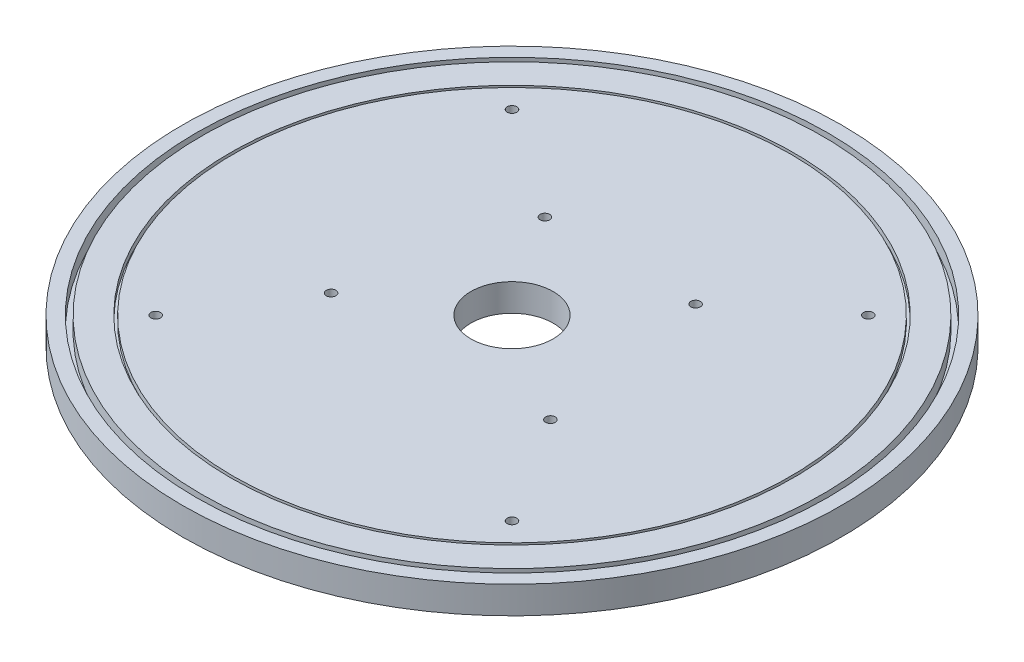
ISO-10303-21;
HEADER;
FILE_DESCRIPTION(('STEP AP214'),'2;1');
FILE_NAME('part.step','',(''),(''),'','','');
FILE_SCHEMA(('AUTOMOTIVE_DESIGN { 1 0 10303 214 1 1 1 1 }'));
ENDSEC;
DATA;
#1=APPLICATION_CONTEXT('core data for automotive mechanical design processes');
#2=APPLICATION_PROTOCOL_DEFINITION('international standard','automotive_design',2000,#1);
#3=PRODUCT_CONTEXT('',#1,'mechanical');
#4=PRODUCT('Part','Part','',(#3));
#5=PRODUCT_RELATED_PRODUCT_CATEGORY('part','',(#4));
#6=PRODUCT_DEFINITION_FORMATION('','',#4);
#7=PRODUCT_DEFINITION_CONTEXT('part definition',#1,'design');
#8=PRODUCT_DEFINITION('design','',#6,#7);
#9=PRODUCT_DEFINITION_SHAPE('','',#8);
#10=(LENGTH_UNIT() NAMED_UNIT(*) SI_UNIT(.MILLI.,.METRE.));
#11=(NAMED_UNIT(*) PLANE_ANGLE_UNIT() SI_UNIT($,.RADIAN.));
#12=(NAMED_UNIT(*) SI_UNIT($,.STERADIAN.) SOLID_ANGLE_UNIT());
#13=UNCERTAINTY_MEASURE_WITH_UNIT(LENGTH_MEASURE(1.E-05),#10,'distance_accuracy_value','');
#14=(GEOMETRIC_REPRESENTATION_CONTEXT(3) GLOBAL_UNCERTAINTY_ASSIGNED_CONTEXT((#13)) GLOBAL_UNIT_ASSIGNED_CONTEXT((#10,
#11,#12)) REPRESENTATION_CONTEXT('',''));
#15=CARTESIAN_POINT('',(0.,0.,0.));
#16=DIRECTION('',(0.,0.,1.));
#17=DIRECTION('',(1.,0.,0.));
#18=AXIS2_PLACEMENT_3D('',#15,#16,#17);
#19=CARTESIAN_POINT('',(0.,10.,-115.250303869911));
#20=DIRECTION('',(0.,-1.,0.));
#21=DIRECTION('',(0.,0.,-1.));
#22=AXIS2_PLACEMENT_3D('',#19,#20,#21);
#23=PLANE('',#22);
#24=CARTESIAN_POINT('',(0.,10.,-0.00437551765879174));
#25=DIRECTION('',(0.,1.,0.));
#26=DIRECTION('',(0.,0.,1.));
#27=AXIS2_PLACEMENT_3D('',#24,#25,#26);
#28=CIRCLE('',#27,115.245928352253);
#29=CARTESIAN_POINT('',(0.,10.,115.241552834594));
#30=VERTEX_POINT('',#29);
#31=EDGE_CURVE('E66',#30,#30,#28,.T.);
#32=ORIENTED_EDGE('',*,*,#31,.F.);
#33=EDGE_LOOP('',(#32));
#34=FACE_BOUND('',#33,.T.);
#35=CARTESIAN_POINT('',(0.,10.,-0.00437551765879174));
#36=DIRECTION('',(0.,1.,0.));
#37=DIRECTION('',(0.,0.,1.));
#38=AXIS2_PLACEMENT_3D('',#35,#36,#37);
#39=CIRCLE('',#38,120.249921644883);
#40=CARTESIAN_POINT('',(0.,10.,120.245546127224));
#41=VERTEX_POINT('',#40);
#42=EDGE_CURVE('E10',#41,#41,#39,.T.);
#43=ORIENTED_EDGE('',*,*,#42,.T.);
#44=EDGE_LOOP('',(#43));
#45=FACE_BOUND('',#44,.T.);
#46=ADVANCED_FACE('F32',(#34,#45),#23,.F.);
#47=CARTESIAN_POINT('',(0.,9.99999999999999,-0.00437551765879174));
#48=DIRECTION('',(0.,1.,0.));
#49=DIRECTION('',(0.,0.,1.));
#50=AXIS2_PLACEMENT_3D('',#47,#48,#49);
#51=CYLINDRICAL_SURFACE('',#50,120.249921644883);
#52=ORIENTED_EDGE('',*,*,#42,.F.);
#53=EDGE_LOOP('',(#52));
#54=FACE_BOUND('',#53,.T.);
#55=CARTESIAN_POINT('',(0.,0.,-0.00437551765879174));
#56=DIRECTION('',(0.,1.,0.));
#57=DIRECTION('',(0.,0.,1.));
#58=AXIS2_PLACEMENT_3D('',#55,#56,#57);
#59=CIRCLE('',#58,120.249921644883);
#60=CARTESIAN_POINT('',(0.,0.,120.245546127224));
#61=VERTEX_POINT('',#60);
#62=EDGE_CURVE('E38',#61,#61,#59,.T.);
#63=ORIENTED_EDGE('',*,*,#62,.T.);
#64=EDGE_LOOP('',(#63));
#65=FACE_BOUND('',#64,.T.);
#66=ADVANCED_FACE('F138',(#54,#65),#51,.T.);
#67=CARTESIAN_POINT('',(0.,0.,-120.254297162542));
#68=DIRECTION('',(0.,1.,0.));
#69=DIRECTION('',(0.,0.,1.));
#70=AXIS2_PLACEMENT_3D('',#67,#68,#69);
#71=PLANE('',#70);
#72=CARTESIAN_POINT('',(-65.,0.,-65.));
#73=DIRECTION('',(0.,-1.,0.));
#74=DIRECTION('',(0.,0.,-1.));
#75=AXIS2_PLACEMENT_3D('',#72,#73,#74);
#76=CIRCLE('',#75,1.75);
#77=CARTESIAN_POINT('',(-65.,0.,-66.75));
#78=VERTEX_POINT('',#77);
#79=EDGE_CURVE('E113',#78,#78,#76,.T.);
#80=ORIENTED_EDGE('',*,*,#79,.F.);
#81=EDGE_LOOP('',(#80));
#82=FACE_BOUND('',#81,.T.);
#83=CARTESIAN_POINT('',(65.,0.,65.));
#84=DIRECTION('',(0.,-1.,0.));
#85=DIRECTION('',(0.,0.,-1.));
#86=AXIS2_PLACEMENT_3D('',#83,#84,#85);
#87=CIRCLE('',#86,1.75);
#88=CARTESIAN_POINT('',(65.,0.,63.25));
#89=VERTEX_POINT('',#88);
#90=EDGE_CURVE('E106',#89,#89,#87,.T.);
#91=ORIENTED_EDGE('',*,*,#90,.F.);
#92=EDGE_LOOP('',(#91));
#93=FACE_BOUND('',#92,.T.);
#94=CARTESIAN_POINT('',(65.,0.,-65.));
#95=DIRECTION('',(0.,-1.,0.));
#96=DIRECTION('',(0.,0.,-1.));
#97=AXIS2_PLACEMENT_3D('',#94,#95,#96);
#98=CIRCLE('',#97,1.75);
#99=CARTESIAN_POINT('',(65.,0.,-66.75));
#100=VERTEX_POINT('',#99);
#101=EDGE_CURVE('E118',#100,#100,#98,.T.);
#102=ORIENTED_EDGE('',*,*,#101,.F.);
#103=EDGE_LOOP('',(#102));
#104=FACE_BOUND('',#103,.T.);
#105=CARTESIAN_POINT('',(-65.,0.,65.));
#106=DIRECTION('',(0.,-1.,0.));
#107=DIRECTION('',(0.,0.,-1.));
#108=AXIS2_PLACEMENT_3D('',#105,#106,#107);
#109=CIRCLE('',#108,1.75);
#110=CARTESIAN_POINT('',(-65.,0.,63.25));
#111=VERTEX_POINT('',#110);
#112=EDGE_CURVE('E100',#111,#111,#109,.T.);
#113=ORIENTED_EDGE('',*,*,#112,.F.);
#114=EDGE_LOOP('',(#113));
#115=FACE_BOUND('',#114,.T.);
#116=CARTESIAN_POINT('',(30.,0.,-37.));
#117=DIRECTION('',(0.,-1.,0.));
#118=DIRECTION('',(0.,0.,-1.));
#119=AXIS2_PLACEMENT_3D('',#116,#117,#118);
#120=CIRCLE('',#119,1.75);
#121=CARTESIAN_POINT('',(30.,0.,-38.75));
#122=VERTEX_POINT('',#121);
#123=EDGE_CURVE('E82',#122,#122,#120,.T.);
#124=ORIENTED_EDGE('',*,*,#123,.F.);
#125=EDGE_LOOP('',(#124));
#126=FACE_BOUND('',#125,.T.);
#127=CARTESIAN_POINT('',(40.,0.,26.));
#128=DIRECTION('',(0.,-1.,0.));
#129=DIRECTION('',(0.,0.,-1.));
#130=AXIS2_PLACEMENT_3D('',#127,#128,#129);
#131=CIRCLE('',#130,1.75);
#132=CARTESIAN_POINT('',(40.,0.,24.25));
#133=VERTEX_POINT('',#132);
#134=EDGE_CURVE('E89',#133,#133,#131,.T.);
#135=ORIENTED_EDGE('',*,*,#134,.F.);
#136=EDGE_LOOP('',(#135));
#137=FACE_BOUND('',#136,.T.);
#138=CARTESIAN_POINT('',(-40.,0.,26.));
#139=DIRECTION('',(0.,-1.,0.));
#140=DIRECTION('',(0.,0.,-1.));
#141=AXIS2_PLACEMENT_3D('',#138,#139,#140);
#142=CIRCLE('',#141,1.75);
#143=CARTESIAN_POINT('',(-40.,0.,24.25));
#144=VERTEX_POINT('',#143);
#145=EDGE_CURVE('E95',#144,#144,#142,.T.);
#146=ORIENTED_EDGE('',*,*,#145,.F.);
#147=EDGE_LOOP('',(#146));
#148=FACE_BOUND('',#147,.T.);
#149=CARTESIAN_POINT('',(-25.,0.,-37.));
#150=DIRECTION('',(0.,-1.,0.));
#151=DIRECTION('',(0.,0.,-1.));
#152=AXIS2_PLACEMENT_3D('',#149,#150,#151);
#153=CIRCLE('',#152,1.75);
#154=CARTESIAN_POINT('',(-25.,0.,-38.75));
#155=VERTEX_POINT('',#154);
#156=EDGE_CURVE('E76',#155,#155,#153,.T.);
#157=ORIENTED_EDGE('',*,*,#156,.F.);
#158=EDGE_LOOP('',(#157));
#159=FACE_BOUND('',#158,.T.);
#160=CARTESIAN_POINT('',(0.,0.,0.));
#161=DIRECTION('',(0.,1.,0.));
#162=DIRECTION('',(0.,0.,1.));
#163=AXIS2_PLACEMENT_3D('',#160,#161,#162);
#164=CIRCLE('',#163,15.);
#165=CARTESIAN_POINT('',(0.,0.,15.));
#166=VERTEX_POINT('',#165);
#167=EDGE_CURVE('E69',#166,#166,#164,.T.);
#168=ORIENTED_EDGE('',*,*,#167,.T.);
#169=EDGE_LOOP('',(#168));
#170=FACE_BOUND('',#169,.T.);
#171=ORIENTED_EDGE('',*,*,#62,.F.);
#172=EDGE_LOOP('',(#171));
#173=FACE_BOUND('',#172,.T.);
#174=ADVANCED_FACE('F135',(#82,#93,#104,#115,#126,#137,#148,#159,#170,#173),#71,.F.);
#175=CARTESIAN_POINT('',(0.,9.99999999999999,-101.754375517659));
#176=DIRECTION('',(0.,-1.,0.));
#177=DIRECTION('',(0.,0.,-1.));
#178=AXIS2_PLACEMENT_3D('',#175,#176,#177);
#179=PLANE('',#178);
#180=CARTESIAN_POINT('',(-65.,10.,-65.));
#181=DIRECTION('',(0.,-1.,0.));
#182=DIRECTION('',(0.,0.,-1.));
#183=AXIS2_PLACEMENT_3D('',#180,#181,#182);
#184=CIRCLE('',#183,1.75);
#185=CARTESIAN_POINT('',(-65.,10.,-66.75));
#186=VERTEX_POINT('',#185);
#187=EDGE_CURVE('E103',#186,#186,#184,.T.);
#188=ORIENTED_EDGE('',*,*,#187,.T.);
#189=EDGE_LOOP('',(#188));
#190=FACE_BOUND('',#189,.T.);
#191=CARTESIAN_POINT('',(65.,10.,65.));
#192=DIRECTION('',(0.,-1.,0.));
#193=DIRECTION('',(0.,0.,-1.));
#194=AXIS2_PLACEMENT_3D('',#191,#192,#193);
#195=CIRCLE('',#194,1.75);
#196=CARTESIAN_POINT('',(65.,10.,63.25));
#197=VERTEX_POINT('',#196);
#198=EDGE_CURVE('E109',#197,#197,#195,.T.);
#199=ORIENTED_EDGE('',*,*,#198,.T.);
#200=EDGE_LOOP('',(#199));
#201=FACE_BOUND('',#200,.T.);
#202=CARTESIAN_POINT('',(65.,10.,-65.));
#203=DIRECTION('',(0.,-1.,0.));
#204=DIRECTION('',(0.,0.,-1.));
#205=AXIS2_PLACEMENT_3D('',#202,#203,#204);
#206=CIRCLE('',#205,1.75);
#207=CARTESIAN_POINT('',(65.,10.,-66.75));
#208=VERTEX_POINT('',#207);
#209=EDGE_CURVE('E110',#208,#208,#206,.T.);
#210=ORIENTED_EDGE('',*,*,#209,.T.);
#211=EDGE_LOOP('',(#210));
#212=FACE_BOUND('',#211,.T.);
#213=CARTESIAN_POINT('',(-65.,10.,65.));
#214=DIRECTION('',(0.,-1.,0.));
#215=DIRECTION('',(0.,0.,-1.));
#216=AXIS2_PLACEMENT_3D('',#213,#214,#215);
#217=CIRCLE('',#216,1.75);
#218=CARTESIAN_POINT('',(-65.,10.,63.25));
#219=VERTEX_POINT('',#218);
#220=EDGE_CURVE('E86',#219,#219,#217,.T.);
#221=ORIENTED_EDGE('',*,*,#220,.T.);
#222=EDGE_LOOP('',(#221));
#223=FACE_BOUND('',#222,.T.);
#224=CARTESIAN_POINT('',(30.,10.,-37.));
#225=DIRECTION('',(0.,-1.,0.));
#226=DIRECTION('',(0.,0.,-1.));
#227=AXIS2_PLACEMENT_3D('',#224,#225,#226);
#228=CIRCLE('',#227,1.75);
#229=CARTESIAN_POINT('',(30.,10.,-38.75));
#230=VERTEX_POINT('',#229);
#231=EDGE_CURVE('E85',#230,#230,#228,.T.);
#232=ORIENTED_EDGE('',*,*,#231,.T.);
#233=EDGE_LOOP('',(#232));
#234=FACE_BOUND('',#233,.T.);
#235=CARTESIAN_POINT('',(40.,10.,26.));
#236=DIRECTION('',(0.,-1.,0.));
#237=DIRECTION('',(0.,0.,-1.));
#238=AXIS2_PLACEMENT_3D('',#235,#236,#237);
#239=CIRCLE('',#238,1.75);
#240=CARTESIAN_POINT('',(40.,10.,24.25));
#241=VERTEX_POINT('',#240);
#242=EDGE_CURVE('E92',#241,#241,#239,.T.);
#243=ORIENTED_EDGE('',*,*,#242,.T.);
#244=EDGE_LOOP('',(#243));
#245=FACE_BOUND('',#244,.T.);
#246=CARTESIAN_POINT('',(-40.,10.,26.));
#247=DIRECTION('',(0.,-1.,0.));
#248=DIRECTION('',(0.,0.,-1.));
#249=AXIS2_PLACEMENT_3D('',#246,#247,#248);
#250=CIRCLE('',#249,1.75);
#251=CARTESIAN_POINT('',(-40.,10.,24.25));
#252=VERTEX_POINT('',#251);
#253=EDGE_CURVE('E79',#252,#252,#250,.T.);
#254=ORIENTED_EDGE('',*,*,#253,.T.);
#255=EDGE_LOOP('',(#254));
#256=FACE_BOUND('',#255,.T.);
#257=CARTESIAN_POINT('',(-25.,10.,-37.));
#258=DIRECTION('',(0.,-1.,0.));
#259=DIRECTION('',(0.,0.,-1.));
#260=AXIS2_PLACEMENT_3D('',#257,#258,#259);
#261=CIRCLE('',#260,1.75);
#262=CARTESIAN_POINT('',(-25.,10.,-38.75));
#263=VERTEX_POINT('',#262);
#264=EDGE_CURVE('E73',#263,#263,#261,.T.);
#265=ORIENTED_EDGE('',*,*,#264,.T.);
#266=EDGE_LOOP('',(#265));
#267=FACE_BOUND('',#266,.T.);
#268=CARTESIAN_POINT('',(0.,9.99999999999999,0.));
#269=DIRECTION('',(0.,1.,0.));
#270=DIRECTION('',(0.,0.,1.));
#271=AXIS2_PLACEMENT_3D('',#268,#269,#270);
#272=CIRCLE('',#271,15.);
#273=CARTESIAN_POINT('',(0.,9.99999999999999,15.));
#274=VERTEX_POINT('',#273);
#275=EDGE_CURVE('E70',#274,#274,#272,.T.);
#276=ORIENTED_EDGE('',*,*,#275,.F.);
#277=EDGE_LOOP('',(#276));
#278=FACE_BOUND('',#277,.T.);
#279=CARTESIAN_POINT('',(0.,10.,-0.00437551765879174));
#280=DIRECTION('',(0.,1.,0.));
#281=DIRECTION('',(0.,0.,1.));
#282=AXIS2_PLACEMENT_3D('',#279,#280,#281);
#283=CIRCLE('',#282,101.75);
#284=CARTESIAN_POINT('',(0.,10.,101.745624482341));
#285=VERTEX_POINT('',#284);
#286=EDGE_CURVE('E42',#285,#285,#283,.T.);
#287=ORIENTED_EDGE('',*,*,#286,.T.);
#288=EDGE_LOOP('',(#287));
#289=FACE_BOUND('',#288,.T.);
#290=ADVANCED_FACE('F124',(#190,#201,#212,#223,#234,#245,#256,#267,#278,#289),#179,.F.);
#291=CARTESIAN_POINT('',(0.,9.99999999999999,-0.00437551765879174));
#292=DIRECTION('',(0.,1.,0.));
#293=DIRECTION('',(0.,0.,1.));
#294=AXIS2_PLACEMENT_3D('',#291,#292,#293);
#295=CYLINDRICAL_SURFACE('',#294,101.75);
#296=ORIENTED_EDGE('',*,*,#286,.F.);
#297=EDGE_LOOP('',(#296));
#298=FACE_BOUND('',#297,.T.);
#299=CARTESIAN_POINT('',(0.,7.87270313591691,-0.00437551765879174));
#300=DIRECTION('',(0.,1.,0.));
#301=DIRECTION('',(0.,0.,1.));
#302=AXIS2_PLACEMENT_3D('',#299,#300,#301);
#303=CIRCLE('',#302,101.75);
#304=CARTESIAN_POINT('',(0.,7.87270313591691,101.745624482341));
#305=VERTEX_POINT('',#304);
#306=EDGE_CURVE('E46',#305,#305,#303,.T.);
#307=ORIENTED_EDGE('',*,*,#306,.T.);
#308=EDGE_LOOP('',(#307));
#309=FACE_BOUND('',#308,.T.);
#310=ADVANCED_FACE('F164',(#298,#309),#295,.T.);
#311=CARTESIAN_POINT('',(0.,7.87270313591691,-101.754375517659));
#312=DIRECTION('',(0.,-1.,0.));
#313=DIRECTION('',(0.,0.,-1.));
#314=AXIS2_PLACEMENT_3D('',#311,#312,#313);
#315=PLANE('',#314);
#316=ORIENTED_EDGE('',*,*,#306,.F.);
#317=EDGE_LOOP('',(#316));
#318=FACE_BOUND('',#317,.T.);
#319=CARTESIAN_POINT('',(0.,7.87270313591691,-0.00437551765879174));
#320=DIRECTION('',(0.,1.,0.));
#321=DIRECTION('',(0.,0.,1.));
#322=AXIS2_PLACEMENT_3D('',#319,#320,#321);
#323=CIRCLE('',#322,102.75);
#324=CARTESIAN_POINT('',(0.,7.87270313591691,102.745624482341));
#325=VERTEX_POINT('',#324);
#326=EDGE_CURVE('E51',#325,#325,#323,.T.);
#327=ORIENTED_EDGE('',*,*,#326,.T.);
#328=EDGE_LOOP('',(#327));
#329=FACE_BOUND('',#328,.T.);
#330=ADVANCED_FACE('F171',(#318,#329),#315,.F.);
#331=CARTESIAN_POINT('',(0.,9.99999999999999,-0.00437551765879174));
#332=DIRECTION('',(0.,1.,0.));
#333=DIRECTION('',(0.,0.,1.));
#334=AXIS2_PLACEMENT_3D('',#331,#332,#333);
#335=CYLINDRICAL_SURFACE('',#334,102.75);
#336=ORIENTED_EDGE('',*,*,#326,.F.);
#337=EDGE_LOOP('',(#336));
#338=FACE_BOUND('',#337,.T.);
#339=CARTESIAN_POINT('',(0.,10.,-0.00437551765879174));
#340=DIRECTION('',(0.,1.,0.));
#341=DIRECTION('',(0.,0.,1.));
#342=AXIS2_PLACEMENT_3D('',#339,#340,#341);
#343=CIRCLE('',#342,102.75);
#344=CARTESIAN_POINT('',(0.,10.,102.745624482341));
#345=VERTEX_POINT('',#344);
#346=EDGE_CURVE('E54',#345,#345,#343,.T.);
#347=ORIENTED_EDGE('',*,*,#346,.T.);
#348=EDGE_LOOP('',(#347));
#349=FACE_BOUND('',#348,.T.);
#350=ADVANCED_FACE('F177',(#338,#349),#335,.F.);
#351=CARTESIAN_POINT('',(0.,10.,-102.754375517659));
#352=DIRECTION('',(0.,-1.,0.));
#353=DIRECTION('',(0.,0.,-1.));
#354=AXIS2_PLACEMENT_3D('',#351,#352,#353);
#355=PLANE('',#354);
#356=ORIENTED_EDGE('',*,*,#346,.F.);
#357=EDGE_LOOP('',(#356));
#358=FACE_BOUND('',#357,.T.);
#359=CARTESIAN_POINT('',(0.,10.,-0.00437551765879174));
#360=DIRECTION('',(0.,1.,0.));
#361=DIRECTION('',(0.,0.,1.));
#362=AXIS2_PLACEMENT_3D('',#359,#360,#361);
#363=CIRCLE('',#362,113.25);
#364=CARTESIAN_POINT('',(0.,10.,113.245624482341));
#365=VERTEX_POINT('',#364);
#366=EDGE_CURVE('E57',#365,#365,#363,.T.);
#367=ORIENTED_EDGE('',*,*,#366,.T.);
#368=EDGE_LOOP('',(#367));
#369=FACE_BOUND('',#368,.T.);
#370=ADVANCED_FACE('F183',(#358,#369),#355,.F.);
#371=CARTESIAN_POINT('',(0.,9.99999999999999,-0.00437551765879174));
#372=DIRECTION('',(0.,1.,0.));
#373=DIRECTION('',(0.,0.,1.));
#374=AXIS2_PLACEMENT_3D('',#371,#372,#373);
#375=CYLINDRICAL_SURFACE('',#374,113.25);
#376=ORIENTED_EDGE('',*,*,#366,.F.);
#377=EDGE_LOOP('',(#376));
#378=FACE_BOUND('',#377,.T.);
#379=CARTESIAN_POINT('',(0.,5.,-0.00437551765879174));
#380=DIRECTION('',(0.,1.,0.));
#381=DIRECTION('',(0.,0.,1.));
#382=AXIS2_PLACEMENT_3D('',#379,#380,#381);
#383=CIRCLE('',#382,113.25);
#384=CARTESIAN_POINT('',(0.,5.,113.245624482341));
#385=VERTEX_POINT('',#384);
#386=EDGE_CURVE('E60',#385,#385,#383,.T.);
#387=ORIENTED_EDGE('',*,*,#386,.T.);
#388=EDGE_LOOP('',(#387));
#389=FACE_BOUND('',#388,.T.);
#390=ADVANCED_FACE('F189',(#378,#389),#375,.T.);
#391=CARTESIAN_POINT('',(0.,5.,-113.254375517659));
#392=DIRECTION('',(0.,-1.,0.));
#393=DIRECTION('',(0.,0.,-1.));
#394=AXIS2_PLACEMENT_3D('',#391,#392,#393);
#395=PLANE('',#394);
#396=ORIENTED_EDGE('',*,*,#386,.F.);
#397=EDGE_LOOP('',(#396));
#398=FACE_BOUND('',#397,.T.);
#399=CARTESIAN_POINT('',(0.,5.,-0.00437551765879174));
#400=DIRECTION('',(0.,1.,0.));
#401=DIRECTION('',(0.,0.,1.));
#402=AXIS2_PLACEMENT_3D('',#399,#400,#401);
#403=CIRCLE('',#402,115.245928352253);
#404=CARTESIAN_POINT('',(0.,5.,115.241552834594));
#405=VERTEX_POINT('',#404);
#406=EDGE_CURVE('E63',#405,#405,#403,.T.);
#407=ORIENTED_EDGE('',*,*,#406,.T.);
#408=EDGE_LOOP('',(#407));
#409=FACE_BOUND('',#408,.T.);
#410=ADVANCED_FACE('F195',(#398,#409),#395,.F.);
#411=CARTESIAN_POINT('',(0.,9.99999999999999,-0.00437551765879174));
#412=DIRECTION('',(0.,1.,0.));
#413=DIRECTION('',(0.,0.,1.));
#414=AXIS2_PLACEMENT_3D('',#411,#412,#413);
#415=CYLINDRICAL_SURFACE('',#414,115.245928352253);
#416=ORIENTED_EDGE('',*,*,#406,.F.);
#417=EDGE_LOOP('',(#416));
#418=FACE_BOUND('',#417,.T.);
#419=ORIENTED_EDGE('',*,*,#31,.T.);
#420=EDGE_LOOP('',(#419));
#421=FACE_BOUND('',#420,.T.);
#422=ADVANCED_FACE('F158',(#418,#421),#415,.F.);
#423=CARTESIAN_POINT('',(0.,0.,0.));
#424=DIRECTION('',(0.,1.,0.));
#425=DIRECTION('',(0.,0.,1.));
#426=AXIS2_PLACEMENT_3D('',#423,#424,#425);
#427=CYLINDRICAL_SURFACE('',#426,15.);
#428=ORIENTED_EDGE('',*,*,#167,.F.);
#429=EDGE_LOOP('',(#428));
#430=FACE_BOUND('',#429,.T.);
#431=ORIENTED_EDGE('',*,*,#275,.T.);
#432=EDGE_LOOP('',(#431));
#433=FACE_BOUND('',#432,.T.);
#434=ADVANCED_FACE('F154',(#430,#433),#427,.F.);
#435=CARTESIAN_POINT('',(-25.,10.,-37.));
#436=DIRECTION('',(0.,-1.,0.));
#437=DIRECTION('',(0.,0.,-1.));
#438=AXIS2_PLACEMENT_3D('',#435,#436,#437);
#439=CYLINDRICAL_SURFACE('',#438,1.75);
#440=ORIENTED_EDGE('',*,*,#264,.F.);
#441=EDGE_LOOP('',(#440));
#442=FACE_BOUND('',#441,.T.);
#443=ORIENTED_EDGE('',*,*,#156,.T.);
#444=EDGE_LOOP('',(#443));
#445=FACE_BOUND('',#444,.T.);
#446=ADVANCED_FACE('F157',(#442,#445),#439,.F.);
#447=CARTESIAN_POINT('',(-40.,10.,26.));
#448=DIRECTION('',(0.,-1.,0.));
#449=DIRECTION('',(0.,0.,-1.));
#450=AXIS2_PLACEMENT_3D('',#447,#448,#449);
#451=CYLINDRICAL_SURFACE('',#450,1.75);
#452=ORIENTED_EDGE('',*,*,#253,.F.);
#453=EDGE_LOOP('',(#452));
#454=FACE_BOUND('',#453,.T.);
#455=ORIENTED_EDGE('',*,*,#145,.T.);
#456=EDGE_LOOP('',(#455));
#457=FACE_BOUND('',#456,.T.);
#458=ADVANCED_FACE('F220',(#454,#457),#451,.F.);
#459=CARTESIAN_POINT('',(40.,10.,26.));
#460=DIRECTION('',(0.,-1.,0.));
#461=DIRECTION('',(0.,0.,-1.));
#462=AXIS2_PLACEMENT_3D('',#459,#460,#461);
#463=CYLINDRICAL_SURFACE('',#462,1.75);
#464=ORIENTED_EDGE('',*,*,#242,.F.);
#465=EDGE_LOOP('',(#464));
#466=FACE_BOUND('',#465,.T.);
#467=ORIENTED_EDGE('',*,*,#134,.T.);
#468=EDGE_LOOP('',(#467));
#469=FACE_BOUND('',#468,.T.);
#470=ADVANCED_FACE('F225',(#466,#469),#463,.F.);
#471=CARTESIAN_POINT('',(30.,10.,-37.));
#472=DIRECTION('',(0.,-1.,0.));
#473=DIRECTION('',(0.,0.,-1.));
#474=AXIS2_PLACEMENT_3D('',#471,#472,#473);
#475=CYLINDRICAL_SURFACE('',#474,1.75);
#476=ORIENTED_EDGE('',*,*,#231,.F.);
#477=EDGE_LOOP('',(#476));
#478=FACE_BOUND('',#477,.T.);
#479=ORIENTED_EDGE('',*,*,#123,.T.);
#480=EDGE_LOOP('',(#479));
#481=FACE_BOUND('',#480,.T.);
#482=ADVANCED_FACE('F222',(#478,#481),#475,.F.);
#483=CARTESIAN_POINT('',(-65.,10.,65.));
#484=DIRECTION('',(0.,-1.,0.));
#485=DIRECTION('',(0.,0.,-1.));
#486=AXIS2_PLACEMENT_3D('',#483,#484,#485);
#487=CYLINDRICAL_SURFACE('',#486,1.75);
#488=ORIENTED_EDGE('',*,*,#220,.F.);
#489=EDGE_LOOP('',(#488));
#490=FACE_BOUND('',#489,.T.);
#491=ORIENTED_EDGE('',*,*,#112,.T.);
#492=EDGE_LOOP('',(#491));
#493=FACE_BOUND('',#492,.T.);
#494=ADVANCED_FACE('F131',(#490,#493),#487,.F.);
#495=CARTESIAN_POINT('',(65.,10.,-65.));
#496=DIRECTION('',(0.,-1.,0.));
#497=DIRECTION('',(0.,0.,-1.));
#498=AXIS2_PLACEMENT_3D('',#495,#496,#497);
#499=CYLINDRICAL_SURFACE('',#498,1.75);
#500=ORIENTED_EDGE('',*,*,#209,.F.);
#501=EDGE_LOOP('',(#500));
#502=FACE_BOUND('',#501,.T.);
#503=ORIENTED_EDGE('',*,*,#101,.T.);
#504=EDGE_LOOP('',(#503));
#505=FACE_BOUND('',#504,.T.);
#506=ADVANCED_FACE('F127',(#502,#505),#499,.F.);
#507=CARTESIAN_POINT('',(65.,10.,65.));
#508=DIRECTION('',(0.,-1.,0.));
#509=DIRECTION('',(0.,0.,-1.));
#510=AXIS2_PLACEMENT_3D('',#507,#508,#509);
#511=CYLINDRICAL_SURFACE('',#510,1.75);
#512=ORIENTED_EDGE('',*,*,#198,.F.);
#513=EDGE_LOOP('',(#512));
#514=FACE_BOUND('',#513,.T.);
#515=ORIENTED_EDGE('',*,*,#90,.T.);
#516=EDGE_LOOP('',(#515));
#517=FACE_BOUND('',#516,.T.);
#518=ADVANCED_FACE('F130',(#514,#517),#511,.F.);
#519=CARTESIAN_POINT('',(-65.,10.,-65.));
#520=DIRECTION('',(0.,-1.,0.));
#521=DIRECTION('',(0.,0.,-1.));
#522=AXIS2_PLACEMENT_3D('',#519,#520,#521);
#523=CYLINDRICAL_SURFACE('',#522,1.75);
#524=ORIENTED_EDGE('',*,*,#187,.F.);
#525=EDGE_LOOP('',(#524));
#526=FACE_BOUND('',#525,.T.);
#527=ORIENTED_EDGE('',*,*,#79,.T.);
#528=EDGE_LOOP('',(#527));
#529=FACE_BOUND('',#528,.T.);
#530=ADVANCED_FACE('F238',(#526,#529),#523,.F.);
#531=CLOSED_SHELL('',(#46,#66,#174,#290,#310,#330,#350,#370,#390,#410,#422,#434,#446,#458,#470,
#482,#494,#506,#518,#530));
#532=MANIFOLD_SOLID_BREP('B2',#531);
#533=ADVANCED_BREP_SHAPE_REPRESENTATION('',(#18,#532),#14);
#534=SHAPE_DEFINITION_REPRESENTATION(#9,#533);
ENDSEC;
END-ISO-10303-21;
